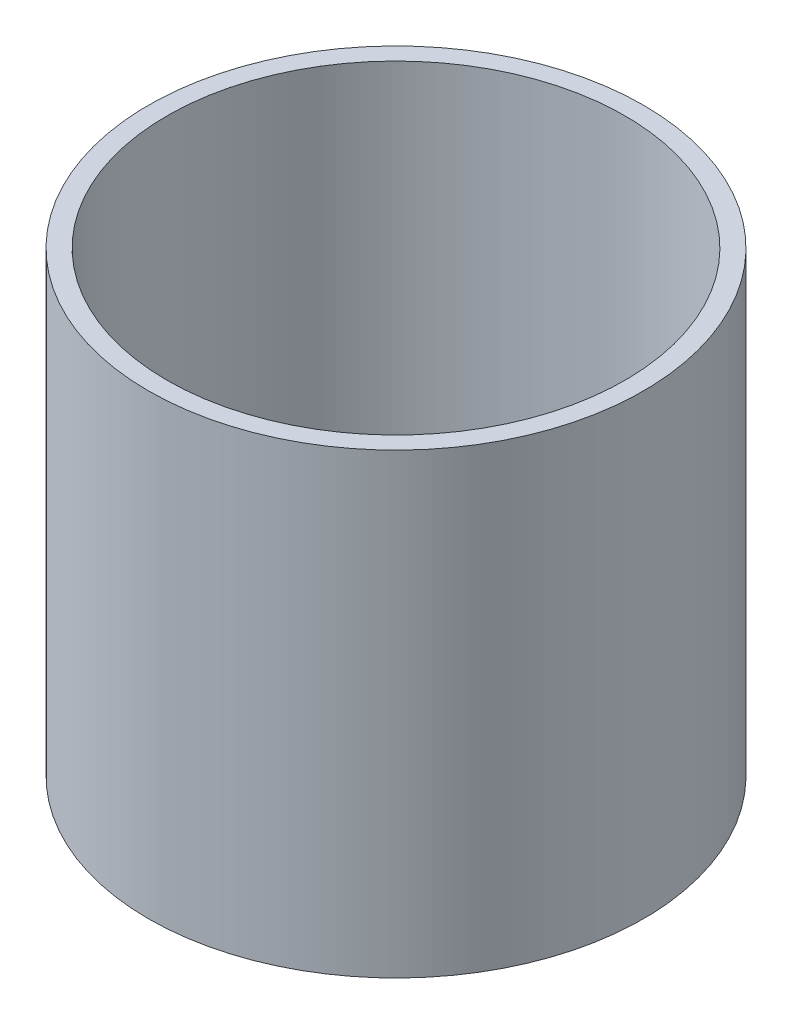
ISO-10303-21;
HEADER;
FILE_DESCRIPTION(('STEP AP214'),'2;1');
FILE_NAME('part.step','',(''),(''),'','','');
FILE_SCHEMA(('AUTOMOTIVE_DESIGN { 1 0 10303 214 1 1 1 1 }'));
ENDSEC;
DATA;
#1=APPLICATION_CONTEXT('core data for automotive mechanical design processes');
#2=APPLICATION_PROTOCOL_DEFINITION('international standard','automotive_design',2000,#1);
#3=PRODUCT_CONTEXT('',#1,'mechanical');
#4=PRODUCT('Part','Part','',(#3));
#5=PRODUCT_RELATED_PRODUCT_CATEGORY('part','',(#4));
#6=PRODUCT_DEFINITION_FORMATION('','',#4);
#7=PRODUCT_DEFINITION_CONTEXT('part definition',#1,'design');
#8=PRODUCT_DEFINITION('design','',#6,#7);
#9=PRODUCT_DEFINITION_SHAPE('','',#8);
#10=(LENGTH_UNIT() NAMED_UNIT(*) SI_UNIT(.MILLI.,.METRE.));
#11=(NAMED_UNIT(*) PLANE_ANGLE_UNIT() SI_UNIT($,.RADIAN.));
#12=(NAMED_UNIT(*) SI_UNIT($,.STERADIAN.) SOLID_ANGLE_UNIT());
#13=UNCERTAINTY_MEASURE_WITH_UNIT(LENGTH_MEASURE(1.E-05),#10,'distance_accuracy_value','');
#14=(GEOMETRIC_REPRESENTATION_CONTEXT(3) GLOBAL_UNCERTAINTY_ASSIGNED_CONTEXT((#13)) GLOBAL_UNIT_ASSIGNED_CONTEXT((#10,
#11,#12)) REPRESENTATION_CONTEXT('',''));
#15=CARTESIAN_POINT('',(0.,0.,0.));
#16=DIRECTION('',(0.,0.,1.));
#17=DIRECTION('',(1.,0.,0.));
#18=AXIS2_PLACEMENT_3D('',#15,#16,#17);
#19=CARTESIAN_POINT('',(0.,50.8,0.));
#20=DIRECTION('',(0.,1.,0.));
#21=DIRECTION('',(0.,0.,1.));
#22=AXIS2_PLACEMENT_3D('',#19,#20,#21);
#23=PLANE('',#22);
#24=CARTESIAN_POINT('',(0.,50.8,0.));
#25=DIRECTION('',(0.,1.,0.));
#26=DIRECTION('',(0.,0.,1.));
#27=AXIS2_PLACEMENT_3D('',#24,#25,#26);
#28=CIRCLE('',#27,27.5);
#29=CARTESIAN_POINT('',(0.,50.8,27.5));
#30=VERTEX_POINT('',#29);
#31=EDGE_CURVE('E10',#30,#30,#28,.T.);
#32=ORIENTED_EDGE('',*,*,#31,.T.);
#33=EDGE_LOOP('',(#32));
#34=FACE_BOUND('',#33,.T.);
#35=CARTESIAN_POINT('',(0.,50.8,0.));
#36=DIRECTION('',(0.,1.,0.));
#37=DIRECTION('',(0.,0.,1.));
#38=AXIS2_PLACEMENT_3D('',#35,#36,#37);
#39=CIRCLE('',#38,25.45);
#40=CARTESIAN_POINT('',(0.,50.8,25.45));
#41=VERTEX_POINT('',#40);
#42=EDGE_CURVE('E42',#41,#41,#39,.T.);
#43=ORIENTED_EDGE('',*,*,#42,.F.);
#44=EDGE_LOOP('',(#43));
#45=FACE_BOUND('',#44,.T.);
#46=ADVANCED_FACE('F31',(#34,#45),#23,.T.);
#47=CARTESIAN_POINT('',(0.,0.,0.));
#48=DIRECTION('',(0.,1.,0.));
#49=DIRECTION('',(0.,0.,1.));
#50=AXIS2_PLACEMENT_3D('',#47,#48,#49);
#51=PLANE('',#50);
#52=CARTESIAN_POINT('',(0.,0.,0.));
#53=DIRECTION('',(0.,1.,0.));
#54=DIRECTION('',(0.,0.,1.));
#55=AXIS2_PLACEMENT_3D('',#52,#53,#54);
#56=CIRCLE('',#55,27.5);
#57=CARTESIAN_POINT('',(0.,0.,27.5));
#58=VERTEX_POINT('',#57);
#59=EDGE_CURVE('E35',#58,#58,#56,.T.);
#60=ORIENTED_EDGE('',*,*,#59,.F.);
#61=EDGE_LOOP('',(#60));
#62=FACE_BOUND('',#61,.T.);
#63=CARTESIAN_POINT('',(0.,0.,0.));
#64=DIRECTION('',(0.,1.,0.));
#65=DIRECTION('',(0.,0.,1.));
#66=AXIS2_PLACEMENT_3D('',#63,#64,#65);
#67=CIRCLE('',#66,25.45);
#68=CARTESIAN_POINT('',(0.,0.,25.45));
#69=VERTEX_POINT('',#68);
#70=EDGE_CURVE('E44',#69,#69,#67,.T.);
#71=ORIENTED_EDGE('',*,*,#70,.T.);
#72=EDGE_LOOP('',(#71));
#73=FACE_BOUND('',#72,.T.);
#74=ADVANCED_FACE('F54',(#62,#73),#51,.F.);
#75=CARTESIAN_POINT('',(0.,50.8,0.));
#76=DIRECTION('',(0.,-1.,0.));
#77=DIRECTION('',(0.,0.,-1.));
#78=AXIS2_PLACEMENT_3D('',#75,#76,#77);
#79=CYLINDRICAL_SURFACE('',#78,27.5);
#80=ORIENTED_EDGE('',*,*,#31,.F.);
#81=EDGE_LOOP('',(#80));
#82=FACE_BOUND('',#81,.T.);
#83=ORIENTED_EDGE('',*,*,#59,.T.);
#84=EDGE_LOOP('',(#83));
#85=FACE_BOUND('',#84,.T.);
#86=ADVANCED_FACE('F33',(#82,#85),#79,.T.);
#87=CARTESIAN_POINT('',(0.,50.8,0.));
#88=DIRECTION('',(0.,-1.,0.));
#89=DIRECTION('',(0.,0.,-1.));
#90=AXIS2_PLACEMENT_3D('',#87,#88,#89);
#91=CYLINDRICAL_SURFACE('',#90,25.45);
#92=ORIENTED_EDGE('',*,*,#42,.T.);
#93=EDGE_LOOP('',(#92));
#94=FACE_BOUND('',#93,.T.);
#95=ORIENTED_EDGE('',*,*,#70,.F.);
#96=EDGE_LOOP('',(#95));
#97=FACE_BOUND('',#96,.T.);
#98=ADVANCED_FACE('F50',(#94,#97),#91,.F.);
#99=CLOSED_SHELL('',(#46,#74,#86,#98));
#100=MANIFOLD_SOLID_BREP('B2',#99);
#101=ADVANCED_BREP_SHAPE_REPRESENTATION('',(#18,#100),#14);
#102=SHAPE_DEFINITION_REPRESENTATION(#9,#101);
ENDSEC;
END-ISO-10303-21;
